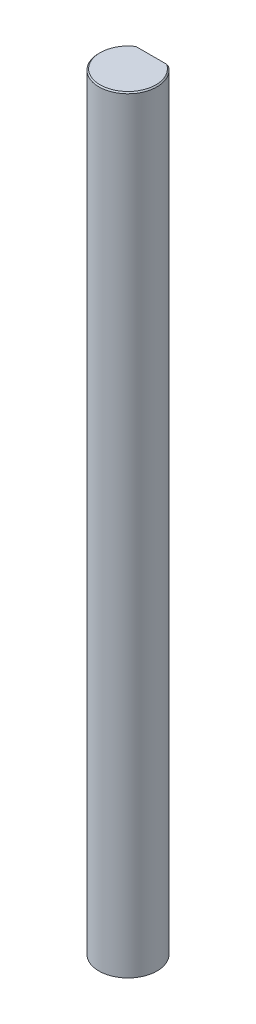
ISO-10303-21;
HEADER;
FILE_DESCRIPTION(('STEP AP214'),'2;1');
FILE_NAME('part.step','',(''),(''),'','','');
FILE_SCHEMA(('AUTOMOTIVE_DESIGN { 1 0 10303 214 1 1 1 1 }'));
ENDSEC;
DATA;
#1=APPLICATION_CONTEXT('core data for automotive mechanical design processes');
#2=APPLICATION_PROTOCOL_DEFINITION('international standard','automotive_design',2000,#1);
#3=PRODUCT_CONTEXT('',#1,'mechanical');
#4=PRODUCT('Part','Part','',(#3));
#5=PRODUCT_RELATED_PRODUCT_CATEGORY('part','',(#4));
#6=PRODUCT_DEFINITION_FORMATION('','',#4);
#7=PRODUCT_DEFINITION_CONTEXT('part definition',#1,'design');
#8=PRODUCT_DEFINITION('design','',#6,#7);
#9=PRODUCT_DEFINITION_SHAPE('','',#8);
#10=(LENGTH_UNIT() NAMED_UNIT(*) SI_UNIT(.MILLI.,.METRE.));
#11=(NAMED_UNIT(*) PLANE_ANGLE_UNIT() SI_UNIT($,.RADIAN.));
#12=(NAMED_UNIT(*) SI_UNIT($,.STERADIAN.) SOLID_ANGLE_UNIT());
#13=UNCERTAINTY_MEASURE_WITH_UNIT(LENGTH_MEASURE(1.E-05),#10,'distance_accuracy_value','');
#14=(GEOMETRIC_REPRESENTATION_CONTEXT(3) GLOBAL_UNCERTAINTY_ASSIGNED_CONTEXT((#13)) GLOBAL_UNIT_ASSIGNED_CONTEXT((#10,
#11,#12)) REPRESENTATION_CONTEXT('',''));
#15=CARTESIAN_POINT('',(0.,0.,0.));
#16=DIRECTION('',(0.,0.,1.));
#17=DIRECTION('',(1.,0.,0.));
#18=AXIS2_PLACEMENT_3D('',#15,#16,#17);
#19=CARTESIAN_POINT('',(0.,66.,0.));
#20=DIRECTION('',(0.,-1.,0.));
#21=DIRECTION('',(0.,0.,-1.));
#22=AXIS2_PLACEMENT_3D('',#19,#20,#21);
#23=CYLINDRICAL_SURFACE('',#22,2.5);
#24=CARTESIAN_POINT('',(0.,65.9,0.));
#25=DIRECTION('',(0.,1.,0.));
#26=DIRECTION('',(0.,0.,1.));
#27=AXIS2_PLACEMENT_3D('',#24,#25,#26);
#28=CIRCLE('',#27,2.5);
#29=CARTESIAN_POINT('',(1.5,65.9,-2.));
#30=VERTEX_POINT('',#29);
#31=CARTESIAN_POINT('',(-1.5,65.9,-2.));
#32=VERTEX_POINT('',#31);
#33=EDGE_CURVE('E98',#30,#32,#28,.F.);
#34=ORIENTED_EDGE('',*,*,#33,.T.);
#35=DIRECTION('',(0.,1.,0.));
#36=VECTOR('',#35,1.);
#37=CARTESIAN_POINT('',(-1.5,48.,-1.99999999999987));
#38=LINE('',#37,#36);
#39=CARTESIAN_POINT('',(-1.5,48.,-1.99999999999987));
#40=VERTEX_POINT('',#39);
#41=EDGE_CURVE('E94',#40,#32,#38,.T.);
#42=ORIENTED_EDGE('',*,*,#41,.F.);
#43=CARTESIAN_POINT('',(0.,48.,-3.35182208528941E-13));
#44=DIRECTION('',(0.,1.,0.));
#45=DIRECTION('',(0.,0.,1.));
#46=AXIS2_PLACEMENT_3D('',#43,#44,#45);
#47=CIRCLE('',#46,2.49999999999963);
#48=CARTESIAN_POINT('',(1.5,48.,-1.99999999999987));
#49=VERTEX_POINT('',#48);
#50=EDGE_CURVE('E83',#49,#40,#47,.T.);
#51=ORIENTED_EDGE('',*,*,#50,.F.);
#52=DIRECTION('',(0.,1.,0.));
#53=VECTOR('',#52,1.);
#54=CARTESIAN_POINT('',(1.5,48.,-1.99999999999987));
#55=LINE('',#54,#53);
#56=EDGE_CURVE('E93',#49,#30,#55,.T.);
#57=ORIENTED_EDGE('',*,*,#56,.T.);
#58=EDGE_LOOP('',(#34,#42,#51,#57));
#59=FACE_BOUND('',#58,.T.);
#60=CARTESIAN_POINT('',(0.,0.,0.));
#61=DIRECTION('',(0.,1.,0.));
#62=DIRECTION('',(0.,0.,1.));
#63=AXIS2_PLACEMENT_3D('',#60,#61,#62);
#64=CIRCLE('',#63,2.5);
#65=CARTESIAN_POINT('',(0.,0.,2.5));
#66=VERTEX_POINT('',#65);
#67=EDGE_CURVE('E101',#66,#66,#64,.T.);
#68=ORIENTED_EDGE('',*,*,#67,.T.);
#69=EDGE_LOOP('',(#68));
#70=FACE_BOUND('',#69,.T.);
#71=ADVANCED_FACE('F50',(#59,#70),#23,.T.);
#72=CARTESIAN_POINT('',(0.,66.,0.));
#73=DIRECTION('',(0.,1.,0.));
#74=DIRECTION('',(0.,0.,1.));
#75=AXIS2_PLACEMENT_3D('',#72,#73,#74);
#76=PLANE('',#75);
#77=DIRECTION('',(1.,0.,0.));
#78=VECTOR('',#77,1.);
#79=CARTESIAN_POINT('',(-1.5,66.,-2.));
#80=LINE('',#79,#78);
#81=CARTESIAN_POINT('',(-1.32664991614215,66.,-2.));
#82=VERTEX_POINT('',#81);
#83=CARTESIAN_POINT('',(1.32664991614215,66.,-2.00000000000001));
#84=VERTEX_POINT('',#83);
#85=EDGE_CURVE('E69',#82,#84,#80,.T.);
#86=ORIENTED_EDGE('',*,*,#85,.F.);
#87=CARTESIAN_POINT('',(0.,66.,0.));
#88=DIRECTION('',(0.,1.,0.));
#89=DIRECTION('',(0.,0.,1.));
#90=AXIS2_PLACEMENT_3D('',#87,#88,#89);
#91=CIRCLE('',#90,2.40000000000001);
#92=EDGE_CURVE('E106',#82,#84,#91,.T.);
#93=ORIENTED_EDGE('',*,*,#92,.T.);
#94=EDGE_LOOP('',(#86,#93));
#95=FACE_BOUND('',#94,.T.);
#96=ADVANCED_FACE('F115',(#95),#76,.T.);
#97=CARTESIAN_POINT('',(0.,0.,0.));
#98=DIRECTION('',(0.,1.,0.));
#99=DIRECTION('',(0.,0.,1.));
#100=AXIS2_PLACEMENT_3D('',#97,#98,#99);
#101=PLANE('',#100);
#102=ORIENTED_EDGE('',*,*,#67,.F.);
#103=EDGE_LOOP('',(#102));
#104=FACE_BOUND('',#103,.T.);
#105=ADVANCED_FACE('F112',(#104),#101,.F.);
#106=CARTESIAN_POINT('',(0.,66.,0.));
#107=DIRECTION('',(0.,-1.,0.));
#108=DIRECTION('',(0.,0.,-1.));
#109=AXIS2_PLACEMENT_3D('',#106,#107,#108);
#110=CONICAL_SURFACE('',#109,2.40000000000001,0.785398163397403);
#111=CARTESIAN_POINT('',(-1.5007,65.8995799372905,-2.));
#112=CARTESIAN_POINT('',(-1.42708906955504,65.943708125276,-2.));
#113=CARTESIAN_POINT('',(-1.35255028646912,65.9864137279171,-2.));
#114=CARTESIAN_POINT('',(-1.20102864633653,66.0679814872656,-2.));
#115=CARTESIAN_POINT('',(-1.12403727311502,66.1068277395034,-2.));
#116=CARTESIAN_POINT('',(-0.966183767085607,66.1799668581388,-2.));
#117=CARTESIAN_POINT('',(-0.885276776450792,66.2141644704595,-2.));
#118=CARTESIAN_POINT('',(-0.72087782410848,66.2754141404895,-2.));
#119=CARTESIAN_POINT('',(-0.637390043616039,66.3024771423141,-2.));
#120=CARTESIAN_POINT('',(-0.494378076021457,66.3405705036067,-2.));
#121=CARTESIAN_POINT('',(-0.435485829337015,66.3539691766453,-2.));
#122=CARTESIAN_POINT('',(-0.316785961583634,66.3759063968446,-2.));
#123=CARTESIAN_POINT('',(-0.25697832972626,66.3844448866793,-2.));
#124=CARTESIAN_POINT('',(-0.137371870609236,66.3961631482798,-2.));
#125=CARTESIAN_POINT('',(-0.0775777217114217,66.3993900316794,-2.));
#126=CARTESIAN_POINT('',(0.0420569627824418,66.400452255892,-2.));
#127=CARTESIAN_POINT('',(0.101897496669154,66.3982877867431,-2.));
#128=CARTESIAN_POINT('',(0.221027193598075,66.3886983403126,-2.));
#129=CARTESIAN_POINT('',(0.280317235128786,66.3812841502832,-2.));
#130=CARTESIAN_POINT('',(0.398094602924326,66.3615933946049,-2.));
#131=CARTESIAN_POINT('',(0.45658151620254,66.3493144176129,-2.));
#132=CARTESIAN_POINT('',(0.631319351416374,66.3057739110465,-2.));
#133=CARTESIAN_POINT('',(0.745947697666487,66.2678950401981,-2.));
#134=CARTESIAN_POINT('',(0.914283142066616,66.2015417467904,-2.));
#135=CARTESIAN_POINT('',(0.969967461590377,66.1777424912968,-2.));
#136=CARTESIAN_POINT('',(1.08014891832393,66.1274853039755,-2.));
#137=CARTESIAN_POINT('',(1.13464583960341,66.1010268934061,-2.));
#138=CARTESIAN_POINT('',(1.2416410979195,66.046367467355,-2.));
#139=CARTESIAN_POINT('',(1.29415748518044,66.0182013572172,-2.));
#140=CARTESIAN_POINT('',(1.39816186968429,65.9601201510541,-2.));
#141=CARTESIAN_POINT('',(1.44965064712638,65.930206455343,-2.));
#142=CARTESIAN_POINT('',(1.5007,65.8995799372905,-2.));
#143=B_SPLINE_CURVE_WITH_KNOTS('',3,(#111,#112,#113,#114,#115,#116,#117,#118,#119,#120,#121,
#122,#123,#124,#125,#126,#127,#128,#129,#130,#131,#132,#133,#134,#135,#136,#137,#138,#139,#140,
#141,#142),.UNSPECIFIED.,.F.,.F.,(4,2,2,2,2,2,2,2,2,2,2,2,2,2,2,4),(0.,0.257554915804208,
0.516130656386004,0.779391449517612,1.04224603334772,1.22326273640654,1.40428157451545,
1.58368602896812,1.76308415973869,1.94211472471903,2.12123414154646,2.48215496031,
2.66379072422291,2.84545924776959,3.02420352986731,3.20280650064576),.UNSPECIFIED.);
#144=EDGE_CURVE('E11',#32,#82,#143,.T.);
#145=ORIENTED_EDGE('',*,*,#144,.F.);
#146=ORIENTED_EDGE('',*,*,#33,.F.);
#147=EDGE_CURVE('E52',#84,#30,#143,.T.);
#148=ORIENTED_EDGE('',*,*,#147,.F.);
#149=ORIENTED_EDGE('',*,*,#92,.F.);
#150=EDGE_LOOP('',(#145,#146,#148,#149));
#151=FACE_BOUND('',#150,.T.);
#152=ADVANCED_FACE('F49',(#151),#110,.T.);
#153=CARTESIAN_POINT('',(-1.5,48.,-1.99999999999987));
#154=DIRECTION('',(0.,0.,1.));
#155=DIRECTION('',(0.,-1.,0.));
#156=AXIS2_PLACEMENT_3D('',#153,#154,#155);
#157=PLANE('',#156);
#158=ORIENTED_EDGE('',*,*,#144,.T.);
#159=ORIENTED_EDGE('',*,*,#85,.T.);
#160=ORIENTED_EDGE('',*,*,#147,.T.);
#161=ORIENTED_EDGE('',*,*,#56,.F.);
#162=DIRECTION('',(1.,0.,0.));
#163=VECTOR('',#162,1.);
#164=CARTESIAN_POINT('',(-1.5,48.,-1.99999999999987));
#165=LINE('',#164,#163);
#166=EDGE_CURVE('E89',#40,#49,#165,.T.);
#167=ORIENTED_EDGE('',*,*,#166,.F.);
#168=ORIENTED_EDGE('',*,*,#41,.T.);
#169=EDGE_LOOP('',(#158,#159,#160,#161,#167,#168));
#170=FACE_BOUND('',#169,.T.);
#171=ADVANCED_FACE('F95',(#170),#157,.F.);
#172=CARTESIAN_POINT('',(0.,48.,-3.35182208528941E-13));
#173=DIRECTION('',(0.,1.,0.));
#174=DIRECTION('',(0.,0.,1.));
#175=AXIS2_PLACEMENT_3D('',#172,#173,#174);
#176=PLANE('',#175);
#177=ORIENTED_EDGE('',*,*,#50,.T.);
#178=ORIENTED_EDGE('',*,*,#166,.T.);
#179=EDGE_LOOP('',(#177,#178));
#180=FACE_BOUND('',#179,.T.);
#181=ADVANCED_FACE('F90',(#180),#176,.T.);
#182=CLOSED_SHELL('',(#71,#96,#105,#152,#171,#181));
#183=MANIFOLD_SOLID_BREP('B2',#182);
#184=ADVANCED_BREP_SHAPE_REPRESENTATION('',(#18,#183),#14);
#185=SHAPE_DEFINITION_REPRESENTATION(#9,#184);
ENDSEC;
END-ISO-10303-21;
